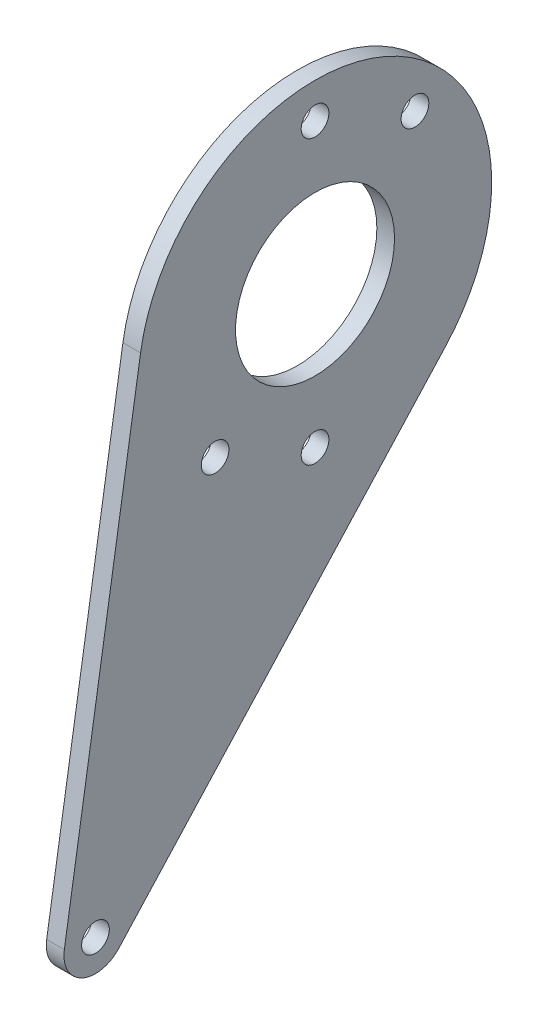
ISO-10303-21;
HEADER;
FILE_DESCRIPTION(('STEP AP214'),'2;1');
FILE_NAME('part.step','',(''),(''),'','','');
FILE_SCHEMA(('AUTOMOTIVE_DESIGN { 1 0 10303 214 1 1 1 1 }'));
ENDSEC;
DATA;
#1=APPLICATION_CONTEXT('core data for automotive mechanical design processes');
#2=APPLICATION_PROTOCOL_DEFINITION('international standard','automotive_design',2000,#1);
#3=PRODUCT_CONTEXT('',#1,'mechanical');
#4=PRODUCT('Part','Part','',(#3));
#5=PRODUCT_RELATED_PRODUCT_CATEGORY('part','',(#4));
#6=PRODUCT_DEFINITION_FORMATION('','',#4);
#7=PRODUCT_DEFINITION_CONTEXT('part definition',#1,'design');
#8=PRODUCT_DEFINITION('design','',#6,#7);
#9=PRODUCT_DEFINITION_SHAPE('','',#8);
#10=(LENGTH_UNIT() NAMED_UNIT(*) SI_UNIT(.MILLI.,.METRE.));
#11=(NAMED_UNIT(*) PLANE_ANGLE_UNIT() SI_UNIT($,.RADIAN.));
#12=(NAMED_UNIT(*) SI_UNIT($,.STERADIAN.) SOLID_ANGLE_UNIT());
#13=UNCERTAINTY_MEASURE_WITH_UNIT(LENGTH_MEASURE(1.E-05),#10,'distance_accuracy_value','');
#14=(GEOMETRIC_REPRESENTATION_CONTEXT(3) GLOBAL_UNCERTAINTY_ASSIGNED_CONTEXT((#13)) GLOBAL_UNIT_ASSIGNED_CONTEXT((#10,
#11,#12)) REPRESENTATION_CONTEXT('',''));
#15=CARTESIAN_POINT('',(0.,0.,0.));
#16=DIRECTION('',(0.,0.,1.));
#17=DIRECTION('',(1.,0.,0.));
#18=AXIS2_PLACEMENT_3D('',#15,#16,#17);
#19=CARTESIAN_POINT('',(3.175,-25.5081137865867,0.));
#20=DIRECTION('',(1.,0.,0.));
#21=DIRECTION('',(0.,0.,-1.));
#22=AXIS2_PLACEMENT_3D('',#19,#20,#21);
#23=PLANE('',#22);
#24=CARTESIAN_POINT('',(3.175,74.3767461712904,-57.4197301176988));
#25=DIRECTION('',(1.,0.,0.));
#26=DIRECTION('',(0.,0.,-1.));
#27=AXIS2_PLACEMENT_3D('',#24,#25,#26);
#28=CIRCLE('',#27,2.48919999999998);
#29=CARTESIAN_POINT('',(3.175,74.3767461712904,-59.9089301176988));
#30=VERTEX_POINT('',#29);
#31=EDGE_CURVE('E179',#30,#30,#28,.T.);
#32=ORIENTED_EDGE('',*,*,#31,.F.);
#33=EDGE_LOOP('',(#32));
#34=FACE_BOUND('',#33,.T.);
#35=CARTESIAN_POINT('',(3.175,31.0162339291493,-39.4592178755633));
#36=DIRECTION('',(1.,0.,0.));
#37=DIRECTION('',(0.,0.,-1.));
#38=AXIS2_PLACEMENT_3D('',#35,#36,#37);
#39=CIRCLE('',#38,2.48919999999999);
#40=CARTESIAN_POINT('',(3.175,31.0162339291493,-41.9484178755633));
#41=VERTEX_POINT('',#40);
#42=EDGE_CURVE('E171',#41,#41,#39,.T.);
#43=ORIENTED_EDGE('',*,*,#42,.F.);
#44=EDGE_LOOP('',(#43));
#45=FACE_BOUND('',#44,.T.);
#46=CARTESIAN_POINT('',(3.175,38.455721687011,-21.498705633425));
#47=DIRECTION('',(1.,0.,0.));
#48=DIRECTION('',(0.,0.,-1.));
#49=AXIS2_PLACEMENT_3D('',#46,#47,#48);
#50=CIRCLE('',#49,2.48919999999999);
#51=CARTESIAN_POINT('',(3.175,38.455721687011,-23.9879056334249));
#52=VERTEX_POINT('',#51);
#53=EDGE_CURVE('E163',#52,#52,#50,.T.);
#54=ORIENTED_EDGE('',*,*,#53,.F.);
#55=EDGE_LOOP('',(#54));
#56=FACE_BOUND('',#55,.T.);
#57=CARTESIAN_POINT('',(3.175,81.8162339291493,-39.4592178755593));
#58=DIRECTION('',(1.,0.,0.));
#59=DIRECTION('',(0.,0.,-1.));
#60=AXIS2_PLACEMENT_3D('',#57,#58,#59);
#61=CIRCLE('',#60,2.48919999999998);
#62=CARTESIAN_POINT('',(3.175,81.8162339291493,-41.9484178755593));
#63=VERTEX_POINT('',#62);
#64=EDGE_CURVE('E155',#63,#63,#61,.T.);
#65=ORIENTED_EDGE('',*,*,#64,.F.);
#66=EDGE_LOOP('',(#65));
#67=FACE_BOUND('',#66,.T.);
#68=CARTESIAN_POINT('',(3.175,56.4162339291493,-39.4592178755633));
#69=DIRECTION('',(1.,0.,0.));
#70=DIRECTION('',(0.,0.,-1.));
#71=AXIS2_PLACEMENT_3D('',#68,#69,#70);
#72=CIRCLE('',#71,14.2875);
#73=CARTESIAN_POINT('',(3.175,56.4162339291493,-53.7467178755633));
#74=VERTEX_POINT('',#73);
#75=EDGE_CURVE('E118',#74,#74,#72,.T.);
#76=ORIENTED_EDGE('',*,*,#75,.F.);
#77=EDGE_LOOP('',(#76));
#78=FACE_BOUND('',#77,.T.);
#79=CARTESIAN_POINT('',(3.175,-25.5081137865867,0.));
#80=DIRECTION('',(1.,0.,0.));
#81=DIRECTION('',(0.,0.,-1.));
#82=AXIS2_PLACEMENT_3D('',#79,#80,#81);
#83=CIRCLE('',#82,5.6642);
#84=CARTESIAN_POINT('',(3.175,-24.6174250627052,5.59373178094465));
#85=VERTEX_POINT('',#84);
#86=CARTESIAN_POINT('',(3.175,-29.3266755541008,-4.18350901369653));
#87=VERTEX_POINT('',#86);
#88=EDGE_CURVE('E98',#85,#87,#83,.T.);
#89=ORIENTED_EDGE('',*,*,#88,.T.);
#90=DIRECTION('',(0.,0.738587799459153,-0.674157298032206));
#91=VECTOR('',#90,1.);
#92=CARTESIAN_POINT('',(3.175,-29.3266755541008,-4.18350901369653));
#93=LINE('',#92,#91);
#94=CARTESIAN_POINT('',(3.175,35.0117397166267,-62.9093805083914));
#95=VERTEX_POINT('',#94);
#96=EDGE_CURVE('E93',#87,#95,#93,.T.);
#97=ORIENTED_EDGE('',*,*,#96,.T.);
#98=CARTESIAN_POINT('',(3.175,56.4162339291493,-39.4592178755633));
#99=DIRECTION('',(1.,0.,0.));
#100=DIRECTION('',(0.,0.,-1.));
#101=AXIS2_PLACEMENT_3D('',#98,#99,#100);
#102=CIRCLE('',#101,31.75);
#103=CARTESIAN_POINT('',(3.175,61.4088837266916,-8.10421910345201));
#104=VERTEX_POINT('',#103);
#105=EDGE_CURVE('E96',#95,#104,#102,.T.);
#106=ORIENTED_EDGE('',*,*,#105,.T.);
#107=DIRECTION('',(0.,-0.98755901644445,0.157248812521019));
#108=VECTOR('',#107,1.);
#109=CARTESIAN_POINT('',(3.175,-24.6174250627052,5.59373178094465));
#110=LINE('',#109,#108);
#111=EDGE_CURVE('E63',#104,#85,#110,.T.);
#112=ORIENTED_EDGE('',*,*,#111,.T.);
#113=EDGE_LOOP('',(#89,#97,#106,#112));
#114=FACE_BOUND('',#113,.T.);
#115=CARTESIAN_POINT('',(3.175,-25.5081137865867,0.));
#116=DIRECTION('',(1.,0.,0.));
#117=DIRECTION('',(0.,0.,-1.));
#118=AXIS2_PLACEMENT_3D('',#115,#116,#117);
#119=CIRCLE('',#118,2.48919999999999);
#120=CARTESIAN_POINT('',(3.175,-25.5081137865867,-2.48919999999999));
#121=VERTEX_POINT('',#120);
#122=EDGE_CURVE('E140',#121,#121,#119,.T.);
#123=ORIENTED_EDGE('',*,*,#122,.F.);
#124=EDGE_LOOP('',(#123));
#125=FACE_BOUND('',#124,.T.);
#126=ADVANCED_FACE('F45',(#34,#45,#56,#67,#78,#114,#125),#23,.T.);
#127=CARTESIAN_POINT('',(0.,-25.5081137865867,0.));
#128=DIRECTION('',(1.,0.,0.));
#129=DIRECTION('',(0.,0.,-1.));
#130=AXIS2_PLACEMENT_3D('',#127,#128,#129);
#131=PLANE('',#130);
#132=CARTESIAN_POINT('',(0.,74.3767461712904,-57.4197301176988));
#133=DIRECTION('',(1.,0.,0.));
#134=DIRECTION('',(0.,0.,-1.));
#135=AXIS2_PLACEMENT_3D('',#132,#133,#134);
#136=CIRCLE('',#135,2.4892);
#137=CARTESIAN_POINT('',(0.,74.3767461712904,-59.9089301176988));
#138=VERTEX_POINT('',#137);
#139=EDGE_CURVE('E175',#138,#138,#136,.T.);
#140=ORIENTED_EDGE('',*,*,#139,.T.);
#141=EDGE_LOOP('',(#140));
#142=FACE_BOUND('',#141,.T.);
#143=CARTESIAN_POINT('',(0.,31.0162339291493,-39.4592178755633));
#144=DIRECTION('',(1.,0.,0.));
#145=DIRECTION('',(0.,0.,-1.));
#146=AXIS2_PLACEMENT_3D('',#143,#144,#145);
#147=CIRCLE('',#146,2.4892);
#148=CARTESIAN_POINT('',(0.,31.0162339291493,-41.9484178755633));
#149=VERTEX_POINT('',#148);
#150=EDGE_CURVE('E167',#149,#149,#147,.T.);
#151=ORIENTED_EDGE('',*,*,#150,.T.);
#152=EDGE_LOOP('',(#151));
#153=FACE_BOUND('',#152,.T.);
#154=CARTESIAN_POINT('',(0.,38.455721687011,-21.498705633425));
#155=DIRECTION('',(1.,0.,0.));
#156=DIRECTION('',(0.,0.,-1.));
#157=AXIS2_PLACEMENT_3D('',#154,#155,#156);
#158=CIRCLE('',#157,2.4892);
#159=CARTESIAN_POINT('',(0.,38.455721687011,-23.987905633425));
#160=VERTEX_POINT('',#159);
#161=EDGE_CURVE('E159',#160,#160,#158,.T.);
#162=ORIENTED_EDGE('',*,*,#161,.T.);
#163=EDGE_LOOP('',(#162));
#164=FACE_BOUND('',#163,.T.);
#165=CARTESIAN_POINT('',(0.,81.8162339291493,-39.4592178755593));
#166=DIRECTION('',(1.,0.,0.));
#167=DIRECTION('',(0.,0.,-1.));
#168=AXIS2_PLACEMENT_3D('',#165,#166,#167);
#169=CIRCLE('',#168,2.4892);
#170=CARTESIAN_POINT('',(0.,81.8162339291493,-41.9484178755593));
#171=VERTEX_POINT('',#170);
#172=EDGE_CURVE('E148',#171,#171,#169,.T.);
#173=ORIENTED_EDGE('',*,*,#172,.T.);
#174=EDGE_LOOP('',(#173));
#175=FACE_BOUND('',#174,.T.);
#176=CARTESIAN_POINT('',(0.,-25.5081137865867,0.));
#177=DIRECTION('',(1.,0.,0.));
#178=DIRECTION('',(0.,0.,-1.));
#179=AXIS2_PLACEMENT_3D('',#176,#177,#178);
#180=CIRCLE('',#179,5.6642);
#181=CARTESIAN_POINT('',(0.,-24.6174250627052,5.59373178094465));
#182=VERTEX_POINT('',#181);
#183=CARTESIAN_POINT('',(0.,-29.3266755541008,-4.18350901369653));
#184=VERTEX_POINT('',#183);
#185=EDGE_CURVE('E114',#182,#184,#180,.T.);
#186=ORIENTED_EDGE('',*,*,#185,.F.);
#187=DIRECTION('',(0.,-0.98755901644445,0.157248812521019));
#188=VECTOR('',#187,1.);
#189=CARTESIAN_POINT('',(0.,-24.6174250627052,5.59373178094465));
#190=LINE('',#189,#188);
#191=CARTESIAN_POINT('',(0.,61.4088837266916,-8.10421910345201));
#192=VERTEX_POINT('',#191);
#193=EDGE_CURVE('E86',#192,#182,#190,.T.);
#194=ORIENTED_EDGE('',*,*,#193,.F.);
#195=CARTESIAN_POINT('',(0.,56.4162339291493,-39.4592178755633));
#196=DIRECTION('',(1.,0.,0.));
#197=DIRECTION('',(0.,0.,-1.));
#198=AXIS2_PLACEMENT_3D('',#195,#196,#197);
#199=CIRCLE('',#198,31.75);
#200=CARTESIAN_POINT('',(0.,35.0117397166267,-62.9093805083914));
#201=VERTEX_POINT('',#200);
#202=EDGE_CURVE('E80',#201,#192,#199,.T.);
#203=ORIENTED_EDGE('',*,*,#202,.F.);
#204=DIRECTION('',(0.,0.738587799459153,-0.674157298032206));
#205=VECTOR('',#204,1.);
#206=CARTESIAN_POINT('',(0.,-29.3266755541008,-4.18350901369653));
#207=LINE('',#206,#205);
#208=EDGE_CURVE('E103',#184,#201,#207,.T.);
#209=ORIENTED_EDGE('',*,*,#208,.F.);
#210=EDGE_LOOP('',(#186,#194,#203,#209));
#211=FACE_BOUND('',#210,.T.);
#212=CARTESIAN_POINT('',(0.,56.4162339291493,-39.4592178755633));
#213=DIRECTION('',(1.,0.,0.));
#214=DIRECTION('',(0.,0.,-1.));
#215=AXIS2_PLACEMENT_3D('',#212,#213,#214);
#216=CIRCLE('',#215,14.2875);
#217=CARTESIAN_POINT('',(0.,56.4162339291493,-53.7467178755633));
#218=VERTEX_POINT('',#217);
#219=EDGE_CURVE('E136',#218,#218,#216,.T.);
#220=ORIENTED_EDGE('',*,*,#219,.T.);
#221=EDGE_LOOP('',(#220));
#222=FACE_BOUND('',#221,.T.);
#223=CARTESIAN_POINT('',(0.,-25.5081137865867,0.));
#224=DIRECTION('',(1.,0.,0.));
#225=DIRECTION('',(0.,0.,-1.));
#226=AXIS2_PLACEMENT_3D('',#223,#224,#225);
#227=CIRCLE('',#226,2.48919999999999);
#228=CARTESIAN_POINT('',(0.,-25.5081137865867,-2.48919999999999));
#229=VERTEX_POINT('',#228);
#230=EDGE_CURVE('E144',#229,#229,#227,.T.);
#231=ORIENTED_EDGE('',*,*,#230,.T.);
#232=EDGE_LOOP('',(#231));
#233=FACE_BOUND('',#232,.T.);
#234=ADVANCED_FACE('F131',(#142,#153,#164,#175,#211,#222,#233),#131,.F.);
#235=CARTESIAN_POINT('',(3.175,-25.5081137865867,0.));
#236=DIRECTION('',(-1.,0.,0.));
#237=DIRECTION('',(0.,0.,1.));
#238=AXIS2_PLACEMENT_3D('',#235,#236,#237);
#239=CYLINDRICAL_SURFACE('',#238,5.6642);
#240=ORIENTED_EDGE('',*,*,#185,.T.);
#241=DIRECTION('',(-1.,0.,0.));
#242=VECTOR('',#241,1.);
#243=CARTESIAN_POINT('',(3.175,-29.3266755541008,-4.18350901369653));
#244=LINE('',#243,#242);
#245=EDGE_CURVE('E11',#87,#184,#244,.T.);
#246=ORIENTED_EDGE('',*,*,#245,.F.);
#247=ORIENTED_EDGE('',*,*,#88,.F.);
#248=DIRECTION('',(-1.,0.,0.));
#249=VECTOR('',#248,1.);
#250=CARTESIAN_POINT('',(3.175,-24.6174250627052,5.59373178094465));
#251=LINE('',#250,#249);
#252=EDGE_CURVE('E110',#85,#182,#251,.T.);
#253=ORIENTED_EDGE('',*,*,#252,.T.);
#254=EDGE_LOOP('',(#240,#246,#247,#253));
#255=FACE_BOUND('',#254,.T.);
#256=ADVANCED_FACE('F47',(#255),#239,.T.);
#257=CARTESIAN_POINT('',(3.175,-29.3266755541008,-4.18350901369653));
#258=DIRECTION('',(0.,0.674157298032206,0.738587799459153));
#259=DIRECTION('',(0.,-0.738587799459154,0.674157298032206));
#260=AXIS2_PLACEMENT_3D('',#257,#258,#259);
#261=PLANE('',#260);
#262=ORIENTED_EDGE('',*,*,#208,.T.);
#263=DIRECTION('',(-1.,0.,0.));
#264=VECTOR('',#263,1.);
#265=CARTESIAN_POINT('',(3.175,35.0117397166267,-62.9093805083914));
#266=LINE('',#265,#264);
#267=EDGE_CURVE('E55',#95,#201,#266,.T.);
#268=ORIENTED_EDGE('',*,*,#267,.F.);
#269=ORIENTED_EDGE('',*,*,#96,.F.);
#270=ORIENTED_EDGE('',*,*,#245,.T.);
#271=EDGE_LOOP('',(#262,#268,#269,#270));
#272=FACE_BOUND('',#271,.T.);
#273=ADVANCED_FACE('F102',(#272),#261,.F.);
#274=CARTESIAN_POINT('',(3.175,56.4162339291493,-39.4592178755633));
#275=DIRECTION('',(-1.,0.,0.));
#276=DIRECTION('',(0.,0.,1.));
#277=AXIS2_PLACEMENT_3D('',#274,#275,#276);
#278=CYLINDRICAL_SURFACE('',#277,31.75);
#279=ORIENTED_EDGE('',*,*,#202,.T.);
#280=DIRECTION('',(-1.,0.,0.));
#281=VECTOR('',#280,1.);
#282=CARTESIAN_POINT('',(3.175,61.4088837266916,-8.10421910345201));
#283=LINE('',#282,#281);
#284=EDGE_CURVE('E105',#104,#192,#283,.T.);
#285=ORIENTED_EDGE('',*,*,#284,.F.);
#286=ORIENTED_EDGE('',*,*,#105,.F.);
#287=ORIENTED_EDGE('',*,*,#267,.T.);
#288=EDGE_LOOP('',(#279,#285,#286,#287));
#289=FACE_BOUND('',#288,.T.);
#290=ADVANCED_FACE('F106',(#289),#278,.T.);
#291=CARTESIAN_POINT('',(3.175,-24.6174250627052,5.59373178094465));
#292=DIRECTION('',(0.,-0.157248812521019,-0.98755901644445));
#293=DIRECTION('',(0.,0.98755901644445,-0.157248812521019));
#294=AXIS2_PLACEMENT_3D('',#291,#292,#293);
#295=PLANE('',#294);
#296=ORIENTED_EDGE('',*,*,#193,.T.);
#297=ORIENTED_EDGE('',*,*,#252,.F.);
#298=ORIENTED_EDGE('',*,*,#111,.F.);
#299=ORIENTED_EDGE('',*,*,#284,.T.);
#300=EDGE_LOOP('',(#296,#297,#298,#299));
#301=FACE_BOUND('',#300,.T.);
#302=ADVANCED_FACE('F128',(#301),#295,.F.);
#303=CARTESIAN_POINT('',(3.175,56.4162339291493,-39.4592178755633));
#304=DIRECTION('',(-1.,0.,0.));
#305=DIRECTION('',(0.,0.,1.));
#306=AXIS2_PLACEMENT_3D('',#303,#304,#305);
#307=CYLINDRICAL_SURFACE('',#306,14.2875);
#308=ORIENTED_EDGE('',*,*,#75,.T.);
#309=EDGE_LOOP('',(#308));
#310=FACE_BOUND('',#309,.T.);
#311=ORIENTED_EDGE('',*,*,#219,.F.);
#312=EDGE_LOOP('',(#311));
#313=FACE_BOUND('',#312,.T.);
#314=ADVANCED_FACE('F197',(#310,#313),#307,.F.);
#315=CARTESIAN_POINT('',(3.175,-25.5081137865867,0.));
#316=DIRECTION('',(-1.,0.,0.));
#317=DIRECTION('',(0.,0.,1.));
#318=AXIS2_PLACEMENT_3D('',#315,#316,#317);
#319=CYLINDRICAL_SURFACE('',#318,2.48919999999999);
#320=ORIENTED_EDGE('',*,*,#122,.T.);
#321=EDGE_LOOP('',(#320));
#322=FACE_BOUND('',#321,.T.);
#323=ORIENTED_EDGE('',*,*,#230,.F.);
#324=EDGE_LOOP('',(#323));
#325=FACE_BOUND('',#324,.T.);
#326=ADVANCED_FACE('F200',(#322,#325),#319,.F.);
#327=CARTESIAN_POINT('',(3.175,81.8162339291493,-39.4592178755593));
#328=DIRECTION('',(1.,0.,0.));
#329=DIRECTION('',(0.,0.,-1.));
#330=AXIS2_PLACEMENT_3D('',#327,#328,#329);
#331=CYLINDRICAL_SURFACE('',#330,2.48919999999999);
#332=ORIENTED_EDGE('',*,*,#172,.F.);
#333=EDGE_LOOP('',(#332));
#334=FACE_BOUND('',#333,.T.);
#335=ORIENTED_EDGE('',*,*,#64,.T.);
#336=EDGE_LOOP('',(#335));
#337=FACE_BOUND('',#336,.T.);
#338=ADVANCED_FACE('F210',(#334,#337),#331,.F.);
#339=CARTESIAN_POINT('',(3.175,38.455721687011,-21.498705633425));
#340=DIRECTION('',(1.,0.,0.));
#341=DIRECTION('',(0.,0.,-1.));
#342=AXIS2_PLACEMENT_3D('',#339,#340,#341);
#343=CYLINDRICAL_SURFACE('',#342,2.48919999999999);
#344=ORIENTED_EDGE('',*,*,#161,.F.);
#345=EDGE_LOOP('',(#344));
#346=FACE_BOUND('',#345,.T.);
#347=ORIENTED_EDGE('',*,*,#53,.T.);
#348=EDGE_LOOP('',(#347));
#349=FACE_BOUND('',#348,.T.);
#350=ADVANCED_FACE('F216',(#346,#349),#343,.F.);
#351=CARTESIAN_POINT('',(3.175,31.0162339291493,-39.4592178755633));
#352=DIRECTION('',(1.,0.,0.));
#353=DIRECTION('',(0.,0.,-1.));
#354=AXIS2_PLACEMENT_3D('',#351,#352,#353);
#355=CYLINDRICAL_SURFACE('',#354,2.48919999999999);
#356=ORIENTED_EDGE('',*,*,#150,.F.);
#357=EDGE_LOOP('',(#356));
#358=FACE_BOUND('',#357,.T.);
#359=ORIENTED_EDGE('',*,*,#42,.T.);
#360=EDGE_LOOP('',(#359));
#361=FACE_BOUND('',#360,.T.);
#362=ADVANCED_FACE('F277',(#358,#361),#355,.F.);
#363=CARTESIAN_POINT('',(3.175,74.3767461712904,-57.4197301176988));
#364=DIRECTION('',(1.,0.,0.));
#365=DIRECTION('',(0.,0.,-1.));
#366=AXIS2_PLACEMENT_3D('',#363,#364,#365);
#367=CYLINDRICAL_SURFACE('',#366,2.48919999999999);
#368=ORIENTED_EDGE('',*,*,#139,.F.);
#369=EDGE_LOOP('',(#368));
#370=FACE_BOUND('',#369,.T.);
#371=ORIENTED_EDGE('',*,*,#31,.T.);
#372=EDGE_LOOP('',(#371));
#373=FACE_BOUND('',#372,.T.);
#374=ADVANCED_FACE('F184',(#370,#373),#367,.F.);
#375=CLOSED_SHELL('',(#126,#234,#256,#273,#290,#302,#314,#326,#338,#350,#362,#374));
#376=MANIFOLD_SOLID_BREP('B2',#375);
#377=ADVANCED_BREP_SHAPE_REPRESENTATION('',(#18,#376),#14);
#378=SHAPE_DEFINITION_REPRESENTATION(#9,#377);
ENDSEC;
END-ISO-10303-21;
